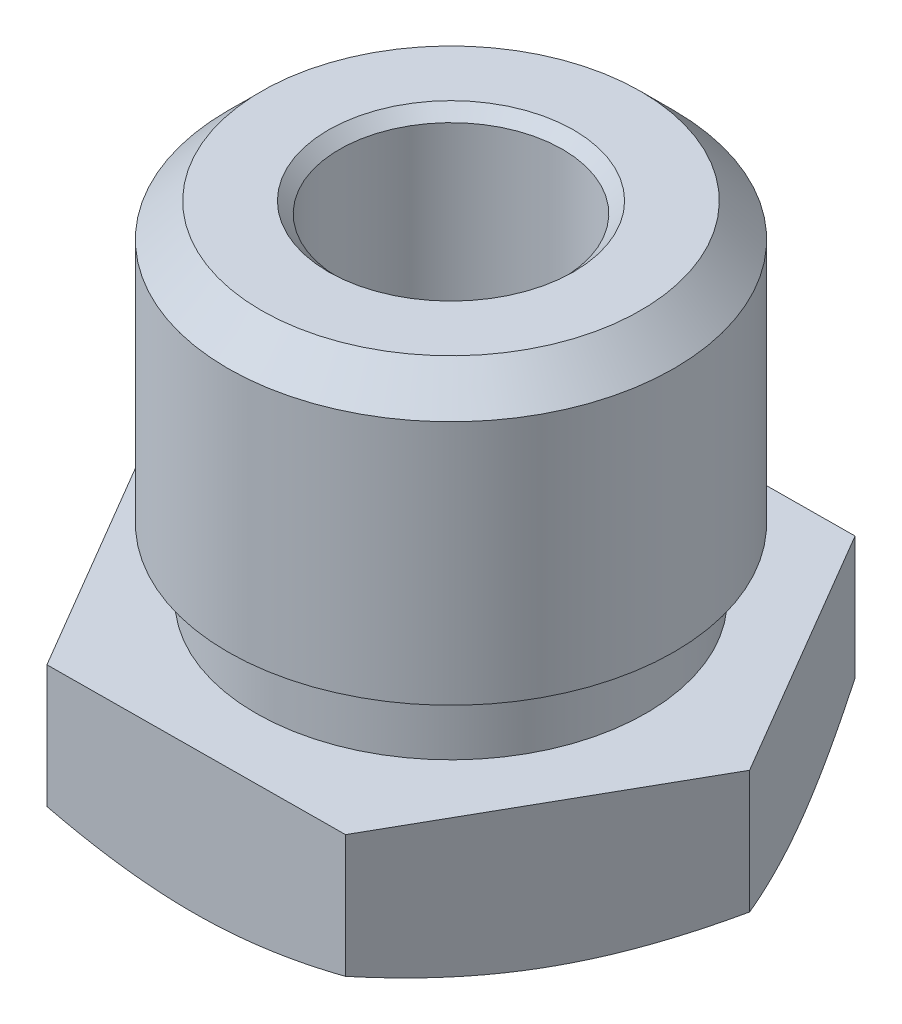
ISO-10303-21;
HEADER;
FILE_DESCRIPTION(('STEP AP214'),'2;1');
FILE_NAME('part.step','',(''),(''),'','','');
FILE_SCHEMA(('AUTOMOTIVE_DESIGN { 1 0 10303 214 1 1 1 1 }'));
ENDSEC;
DATA;
#1=APPLICATION_CONTEXT('core data for automotive mechanical design processes');
#2=APPLICATION_PROTOCOL_DEFINITION('international standard','automotive_design',2000,#1);
#3=PRODUCT_CONTEXT('',#1,'mechanical');
#4=PRODUCT('Part','Part','',(#3));
#5=PRODUCT_RELATED_PRODUCT_CATEGORY('part','',(#4));
#6=PRODUCT_DEFINITION_FORMATION('','',#4);
#7=PRODUCT_DEFINITION_CONTEXT('part definition',#1,'design');
#8=PRODUCT_DEFINITION('design','',#6,#7);
#9=PRODUCT_DEFINITION_SHAPE('','',#8);
#10=(LENGTH_UNIT() NAMED_UNIT(*) SI_UNIT(.MILLI.,.METRE.));
#11=(NAMED_UNIT(*) PLANE_ANGLE_UNIT() SI_UNIT($,.RADIAN.));
#12=(NAMED_UNIT(*) SI_UNIT($,.STERADIAN.) SOLID_ANGLE_UNIT());
#13=UNCERTAINTY_MEASURE_WITH_UNIT(LENGTH_MEASURE(1.E-05),#10,'distance_accuracy_value','');
#14=(GEOMETRIC_REPRESENTATION_CONTEXT(3) GLOBAL_UNCERTAINTY_ASSIGNED_CONTEXT((#13)) GLOBAL_UNIT_ASSIGNED_CONTEXT((#10,
#11,#12)) REPRESENTATION_CONTEXT('',''));
#15=CARTESIAN_POINT('',(0.,0.,0.));
#16=DIRECTION('',(0.,0.,1.));
#17=DIRECTION('',(1.,0.,0.));
#18=AXIS2_PLACEMENT_3D('',#15,#16,#17);
#19=CARTESIAN_POINT('',(13.2786844152626,6.5,-0.0993656540089263));
#20=DIRECTION('',(-0.862259714880802,0.,0.506466370150751));
#21=DIRECTION('',(0.506466370150751,0.,0.862259714880802));
#22=AXIS2_PLACEMENT_3D('',#19,#20,#21);
#23=PLANE('',#22);
#24=DIRECTION('',(0.,-1.,0.));
#25=VECTOR('',#24,1.);
#26=CARTESIAN_POINT('',(13.2786844152626,6.5,-0.0993656540089263));
#27=LINE('',#26,#25);
#28=CARTESIAN_POINT('',(13.2786844152626,6.5,-0.0993656540089263));
#29=VERTEX_POINT('',#28);
#30=CARTESIAN_POINT('',(13.2786844152626,0.999999999999913,-0.0993656540089263));
#31=VERTEX_POINT('',#30);
#32=EDGE_CURVE('E104',#29,#31,#27,.T.);
#33=ORIENTED_EDGE('',*,*,#32,.T.);
#34=CARTESIAN_POINT('',(13.278801889467,1.00005798792879,-0.0991656540089266));
#35=CARTESIAN_POINT('',(13.0892477828478,0.906495480012444,-0.421881789888406));
#36=CARTESIAN_POINT('',(12.8989551950581,0.818485549010916,-0.745855191010019));
#37=CARTESIAN_POINT('',(12.5168543572176,0.655424160118906,-1.39638241040671));
#38=CARTESIAN_POINT('',(12.3250453794867,0.580379375303605,-1.72293746755796));
#39=CARTESIAN_POINT('',(11.9397828409977,0.445101486414631,-2.37884748680155));
#40=CARTESIAN_POINT('',(11.7463272663629,0.384890468454874,-2.70820587752167));
#41=CARTESIAN_POINT('',(11.3582872115426,0.281279927851655,-3.36884462226612));
#42=CARTESIAN_POINT('',(11.1637029318079,0.237877507605416,-3.70012463502266));
#43=CARTESIAN_POINT('',(10.7781213489979,0.170174920080449,-4.35657782767609));
#44=CARTESIAN_POINT('',(10.5871427365605,0.145463994403388,-4.68171918673529));
#45=CARTESIAN_POINT('',(10.2047880025491,0.114463177060262,-5.33267866472373));
#46=CARTESIAN_POINT('',(10.0134118618347,0.108174193966666,-5.65849681623943));
#47=CARTESIAN_POINT('',(9.6309432470842,0.114261147632678,-6.30965017634794));
#48=CARTESIAN_POINT('',(9.43985068958976,0.126616979719078,-6.63498552702868));
#49=CARTESIAN_POINT('',(9.05821021566678,0.169480274015968,-7.28472897620153));
#50=CARTESIAN_POINT('',(8.86766225419606,0.199986188699251,-7.60913715137802));
#51=CARTESIAN_POINT('',(8.49944267573429,0.275586286577359,-8.23603150695678));
#52=CARTESIAN_POINT('',(8.32171553673145,0.319641320413002,-8.53861221366305));
#53=CARTESIAN_POINT('',(7.96725959631279,0.421466529051991,-9.14207395591501));
#54=CARTESIAN_POINT('',(7.7905309034253,0.479238166525155,-9.44295480669108));
#55=CARTESIAN_POINT('',(7.43626366329683,0.607771425592251,-10.0460952864308));
#56=CARTESIAN_POINT('',(7.25873805796857,0.67867070482349,-10.3483328817698));
#57=CARTESIAN_POINT('',(6.90498939101579,0.831480584190287,-10.950590489941));
#58=CARTESIAN_POINT('',(6.72876576088822,0.913386036987412,-11.2506114706506));
#59=CARTESIAN_POINT('',(6.55317155279144,1.00005798792881,-11.5495608594584));
#60=B_SPLINE_CURVE_WITH_KNOTS('',3,(#34,#35,#36,#37,#38,#39,#40,#41,#42,#43,#44,#45,#46,#47,#48,
#49,#50,#51,#52,#53,#54,#55,#56,#57,#58,#59),.UNSPECIFIED.,.F.,.F.,(4,2,2,2,2,2,2,2,2,2,2,2,4),
(0.,1.15741546007654,2.31542487092911,3.47514817024263,4.63467145793502,5.76790726441043,
6.901198961274,8.03326950451839,9.16524353806669,10.2259639835277,11.2867975897379,
12.3594596383154,13.4316217618208),.UNSPECIFIED.);
#61=CARTESIAN_POINT('',(6.55328902699588,0.999999999999936,-11.5493608594584));
#62=VERTEX_POINT('',#61);
#63=EDGE_CURVE('E53',#31,#62,#60,.T.);
#64=ORIENTED_EDGE('',*,*,#63,.T.);
#65=DIRECTION('',(0.,-1.,0.));
#66=VECTOR('',#65,1.);
#67=CARTESIAN_POINT('',(6.55328902699589,6.5,-11.5493608594584));
#68=LINE('',#67,#66);
#69=CARTESIAN_POINT('',(6.55328902699589,6.5,-11.5493608594584));
#70=VERTEX_POINT('',#69);
#71=EDGE_CURVE('E103',#70,#62,#68,.T.);
#72=ORIENTED_EDGE('',*,*,#71,.F.);
#73=DIRECTION('',(-0.506466370150751,0.,-0.862259714880802));
#74=VECTOR('',#73,1.);
#75=CARTESIAN_POINT('',(13.2786844152626,6.5,-0.0993656540089263));
#76=LINE('',#75,#74);
#77=EDGE_CURVE('E373',#29,#70,#76,.T.);
#78=ORIENTED_EDGE('',*,*,#77,.F.);
#79=EDGE_LOOP('',(#33,#64,#72,#78));
#80=FACE_BOUND('',#79,.T.);
#81=ADVANCED_FACE('F38',(#80),#23,.F.);
#82=CARTESIAN_POINT('',(6.55328902699589,6.5,-11.5493608594584));
#83=DIRECTION('',(0.00748288527264228,0.,0.999972002822077));
#84=DIRECTION('',(0.999972002822077,0.,-0.00748288527264229));
#85=AXIS2_PLACEMENT_3D('',#82,#83,#84);
#86=PLANE('',#85);
#87=ORIENTED_EDGE('',*,*,#71,.T.);
#88=CARTESIAN_POINT('',(6.55348902699589,1.00005000196466,-11.5493623560773));
#89=CARTESIAN_POINT('',(6.17923229772127,0.906488004955447,-11.5465617575008));
#90=CARTESIAN_POINT('',(5.80351750874437,0.818478587991021,-11.5437502481253));
#91=CARTESIAN_POINT('',(5.04909540759903,0.655418223151411,-11.5381048360397));
#92=CARTESIAN_POINT('',(4.67038665870723,0.580373948311718,-11.5352709225784));
#93=CARTESIAN_POINT('',(3.90972211150778,0.445097066884958,-11.5295787976773));
#94=CARTESIAN_POINT('',(3.52776233709572,0.384886545907937,-11.5267205564839));
#95=CARTESIAN_POINT('',(2.76161388734343,0.281276966483241,-11.5209873950203));
#96=CARTESIAN_POINT('',(2.37742560777006,0.237875010449097,-11.5181124777116));
#97=CARTESIAN_POINT('',(1.61613116407676,0.170173285486741,-11.5124156392353));
#98=CARTESIAN_POINT('',(1.23906190221761,0.145462761642441,-11.5095939942109));
#99=CARTESIAN_POINT('',(0.484138552019265,0.114462686189678,-11.5039448312311));
#100=CARTESIAN_POINT('',(0.106284425889888,0.108174043157357,-11.5011173129929));
#101=CARTESIAN_POINT('',(-0.648863742889136,0.114261600739779,-11.4954664676744));
#102=CARTESIAN_POINT('',(-1.02615795033378,0.126617696996423,-11.4926431393608));
#103=CARTESIAN_POINT('',(-1.77967101273376,0.16948143639026,-11.4870045296983));
#104=CARTESIAN_POINT('',(-2.15588995662197,0.199987531999137,-11.4841892476838));
#105=CARTESIAN_POINT('',(-2.88290153838933,0.275587568352364,-11.4787489511126));
#106=CARTESIAN_POINT('',(-3.23380381381667,0.319642229755087,-11.4761231161277));
#107=CARTESIAN_POINT('',(-3.93363727744409,0.421466387743175,-11.4708861959905));
#108=CARTESIAN_POINT('',(-4.28256825138991,0.47923734682663,-11.4682751124414));
#109=CARTESIAN_POINT('',(-4.98202913527991,0.607768971979282,-11.4630409803536));
#110=CARTESIAN_POINT('',(-5.33253349355472,0.678667290738526,-11.4604181230205));
#111=CARTESIAN_POINT('',(-6.03097051886239,0.831475033525346,-11.4551916525635));
#112=CARTESIAN_POINT('',(-6.37890430827846,0.913379310541671,-11.4525880310408));
#113=CARTESIAN_POINT('',(-6.72559538826666,1.00005000196464,-11.4499937088305));
#114=B_SPLINE_CURVE_WITH_KNOTS('',3,(#88,#89,#90,#91,#92,#93,#94,#95,#96,#97,#98,#99,#100,#101,
#102,#103,#104,#105,#106,#107,#108,#109,#110,#111,#112,#113),.UNSPECIFIED.,.F.,.F.,(4,2,2,2,2,2,
2,2,2,2,2,2,4),(0.,1.15741306233225,2.31542007088461,3.47514092704066,4.63466177273383,
5.76789534332623,6.90118480460978,8.03325312886427,9.16522494310022,10.225933731874,
11.2867556693873,12.3594057431476,13.4315559193472),.UNSPECIFIED.);
#115=CARTESIAN_POINT('',(-6.72539538826666,0.999999999999913,-11.4499952054494));
#116=VERTEX_POINT('',#115);
#117=EDGE_CURVE('E90',#62,#116,#114,.T.);
#118=ORIENTED_EDGE('',*,*,#117,.T.);
#119=DIRECTION('',(0.,-1.,0.));
#120=VECTOR('',#119,1.);
#121=CARTESIAN_POINT('',(-6.72539538826666,6.5,-11.4499952054494));
#122=LINE('',#121,#120);
#123=CARTESIAN_POINT('',(-6.72539538826666,6.5,-11.4499952054494));
#124=VERTEX_POINT('',#123);
#125=EDGE_CURVE('E110',#124,#116,#122,.T.);
#126=ORIENTED_EDGE('',*,*,#125,.F.);
#127=DIRECTION('',(-0.999972002822077,0.,0.00748288527264229));
#128=VECTOR('',#127,1.);
#129=CARTESIAN_POINT('',(6.55328902699589,6.5,-11.5493608594584));
#130=LINE('',#129,#128);
#131=EDGE_CURVE('E108',#70,#124,#130,.T.);
#132=ORIENTED_EDGE('',*,*,#131,.F.);
#133=EDGE_LOOP('',(#87,#118,#126,#132));
#134=FACE_BOUND('',#133,.T.);
#135=ADVANCED_FACE('F107',(#134),#86,.F.);
#136=CARTESIAN_POINT('',(-6.72539538826666,6.5,-11.4499952054494));
#137=DIRECTION('',(0.869742600153444,0.,0.493505632671326));
#138=DIRECTION('',(0.493505632671326,0.,-0.869742600153445));
#139=AXIS2_PLACEMENT_3D('',#136,#137,#138);
#140=PLANE('',#139);
#141=ORIENTED_EDGE('',*,*,#125,.T.);
#142=CARTESIAN_POINT('',(-6.72528190512059,1.00005748901951,-11.4501952054494));
#143=CARTESIAN_POINT('',(-6.90998520223733,0.906495013021198,-11.1246785036001));
#144=CARTESIAN_POINT('',(-7.0954080822684,0.818485114133238,-10.7978936259216));
#145=CARTESIAN_POINT('',(-7.46773071755255,0.655423789217099,-10.1417210607673));
#146=CARTESIAN_POINT('',(-7.65463118186342,0.580379036261622,-9.81233212366499));
#147=CARTESIAN_POINT('',(-8.0300346068258,0.445101210312064,-9.15073004798871));
#148=CARTESIAN_POINT('',(-8.21853952981428,0.384890223400421,-8.81851345103871));
#149=CARTESIAN_POINT('',(-8.59664939141831,0.281279742845111,-8.15214161573655));
#150=CARTESIAN_POINT('',(-8.78625413471284,0.237877351599687,-7.81798672161351));
#151=CARTESIAN_POINT('',(-9.16196843863417,0.170174817961751,-7.15583676024718));
#152=CARTESIAN_POINT('',(-9.34805978694809,0.145463917388455,-6.82787378995135));
#153=CARTESIAN_POINT('',(-9.72062981965142,0.11446314639355,-6.17126521746428));
#154=CARTESIAN_POINT('',(-9.90710852269132,0.108174184544641,-5.84261958240385));
#155=CARTESIAN_POINT('',(-10.2797895209837,0.114261175939173,-5.18581544679942));
#156=CARTESIAN_POINT('',(-10.4659918975592,0.12661702452909,-4.85765680293364));
#157=CARTESIAN_POINT('',(-10.8378659470453,0.169480346632508,-4.20227481473041));
#158=CARTESIAN_POINT('',(-11.0235376638455,0.199986272618733,-3.87505139304302));
#159=CARTESIAN_POINT('',(-11.3823341688252,0.275586366653234,-3.24271695852426));
#160=CARTESIAN_POINT('',(-11.5555130586223,0.319641377221881,-2.93751059828783));
#161=CARTESIAN_POINT('',(-11.9008980498391,0.421466520223448,-2.32881229693535));
#162=CARTESIAN_POINT('',(-12.0731040455087,0.479238115315458,-2.02532054219103));
#163=CARTESIAN_POINT('',(-12.4183051651242,0.607771272306696,-1.41694629177955));
#164=CARTESIAN_POINT('',(-12.5912876783775,0.678670491534158,-1.11208602089748));
#165=CARTESIAN_POINT('',(-12.9359834959049,0.831480237421918,-0.504602302878869));
#166=CARTESIAN_POINT('',(-13.1076973541314,0.913385616764226,-0.201977879469661));
#167=CARTESIAN_POINT('',(-13.2787978984086,1.00005748901945,0.0995656540089277));
#168=B_SPLINE_CURVE_WITH_KNOTS('',3,(#142,#143,#144,#145,#146,#147,#148,#149,#150,#151,#152,
#153,#154,#155,#156,#157,#158,#159,#160,#161,#162,#163,#164,#165,#166,#167),.UNSPECIFIED.,.F.,
.F.,(4,2,2,2,2,2,2,2,2,2,2,2,4),(0.,1.15741531028125,2.31542457105391,3.47514771773503,
4.63467085286736,5.76790651965949,6.90119807685872,8.03326848147521,9.16524237637546,
10.2259620936075,11.2867949708385,12.3594562713123,13.4316176484328),.UNSPECIFIED.);
#169=CARTESIAN_POINT('',(-13.2786844152626,0.999999999999867,0.0993656540089118));
#170=VERTEX_POINT('',#169);
#171=EDGE_CURVE('E93',#116,#170,#168,.T.);
#172=ORIENTED_EDGE('',*,*,#171,.T.);
#173=DIRECTION('',(0.,-1.,0.));
#174=VECTOR('',#173,1.);
#175=CARTESIAN_POINT('',(-13.2786844152625,6.5,0.0993656540089282));
#176=LINE('',#175,#174);
#177=CARTESIAN_POINT('',(-13.2786844152625,6.5,0.0993656540089282));
#178=VERTEX_POINT('',#177);
#179=EDGE_CURVE('E115',#178,#170,#176,.T.);
#180=ORIENTED_EDGE('',*,*,#179,.F.);
#181=DIRECTION('',(-0.493505632671326,0.,0.869742600153444));
#182=VECTOR('',#181,1.);
#183=CARTESIAN_POINT('',(-6.72539538826666,6.5,-11.4499952054494));
#184=LINE('',#183,#182);
#185=EDGE_CURVE('E370',#124,#178,#184,.T.);
#186=ORIENTED_EDGE('',*,*,#185,.F.);
#187=EDGE_LOOP('',(#141,#172,#180,#186));
#188=FACE_BOUND('',#187,.T.);
#189=ADVANCED_FACE('F195',(#188),#140,.F.);
#190=CARTESIAN_POINT('',(-13.2786844152625,6.5,0.0993656540089282));
#191=DIRECTION('',(0.862259714880802,0.,-0.506466370150751));
#192=DIRECTION('',(-0.506466370150751,0.,-0.862259714880802));
#193=AXIS2_PLACEMENT_3D('',#190,#191,#192);
#194=PLANE('',#193);
#195=ORIENTED_EDGE('',*,*,#179,.T.);
#196=CARTESIAN_POINT('',(-13.278801889467,1.00005798792873,0.0991656540089284));
#197=CARTESIAN_POINT('',(-13.0892477828478,0.906495480012392,0.421881789888409));
#198=CARTESIAN_POINT('',(-12.8989551950581,0.818485549010863,0.745855191010022));
#199=CARTESIAN_POINT('',(-12.5168543572176,0.655424160118849,1.39638241040671));
#200=CARTESIAN_POINT('',(-12.3250453794867,0.580379375303546,1.72293746755796));
#201=CARTESIAN_POINT('',(-11.9397828409977,0.44510148641457,2.37884748680155));
#202=CARTESIAN_POINT('',(-11.7463272663629,0.384890468454813,2.70820587752167));
#203=CARTESIAN_POINT('',(-11.3582872115426,0.281279927851592,3.36884462226613));
#204=CARTESIAN_POINT('',(-11.1637029318079,0.237877507605351,3.70012463502267));
#205=CARTESIAN_POINT('',(-10.7781213489979,0.170174920080382,4.3565778276761));
#206=CARTESIAN_POINT('',(-10.5871427365605,0.14546399440332,4.6817191867353));
#207=CARTESIAN_POINT('',(-10.2047880025491,0.114463177060191,5.33267866472375));
#208=CARTESIAN_POINT('',(-10.0134118618347,0.108174193966594,5.65849681623944));
#209=CARTESIAN_POINT('',(-9.63094324708419,0.114261147632604,6.30965017634795));
#210=CARTESIAN_POINT('',(-9.43985068958975,0.126616979719004,6.6349855270287));
#211=CARTESIAN_POINT('',(-9.05821021566677,0.169480274015891,7.28472897620155));
#212=CARTESIAN_POINT('',(-8.86766225419604,0.199986188699173,7.60913715137804));
#213=CARTESIAN_POINT('',(-8.49944267573428,0.275586286577279,8.2360315069568));
#214=CARTESIAN_POINT('',(-8.32171553673143,0.319641320412921,8.53861221366307));
#215=CARTESIAN_POINT('',(-7.96725959631278,0.421466529051907,9.14207395591502));
#216=CARTESIAN_POINT('',(-7.79053090342528,0.47923816652507,9.44295480669109));
#217=CARTESIAN_POINT('',(-7.43626366329682,0.607771425592162,10.0460952864309));
#218=CARTESIAN_POINT('',(-7.25873805796856,0.678670704823399,10.3483328817698));
#219=CARTESIAN_POINT('',(-6.90498939101578,0.831480584190192,10.950590489941));
#220=CARTESIAN_POINT('',(-6.72876576088821,0.913386036987316,11.2506114706506));
#221=CARTESIAN_POINT('',(-6.55317155279144,1.00005798792871,11.5495608594584));
#222=B_SPLINE_CURVE_WITH_KNOTS('',3,(#196,#197,#198,#199,#200,#201,#202,#203,#204,#205,#206,
#207,#208,#209,#210,#211,#212,#213,#214,#215,#216,#217,#218,#219,#220,#221),.UNSPECIFIED.,.F.,
.F.,(4,2,2,2,2,2,2,2,2,2,2,2,4),(0.,1.15741546007654,2.31542487092912,3.47514817024264,
4.63467145793503,5.76790726441044,6.90119896127402,8.03326950451842,9.16524353806671,
10.2259639835277,11.2867975897379,12.3594596383154,13.4316217618208),.UNSPECIFIED.);
#223=CARTESIAN_POINT('',(-6.5532890269959,0.999999999999844,11.5493608594584));
#224=VERTEX_POINT('',#223);
#225=EDGE_CURVE('E174',#170,#224,#222,.T.);
#226=ORIENTED_EDGE('',*,*,#225,.T.);
#227=DIRECTION('',(0.,-1.,0.));
#228=VECTOR('',#227,1.);
#229=CARTESIAN_POINT('',(-6.55328902699588,6.5,11.5493608594584));
#230=LINE('',#229,#228);
#231=CARTESIAN_POINT('',(-6.55328902699588,6.5,11.5493608594584));
#232=VERTEX_POINT('',#231);
#233=EDGE_CURVE('E352',#232,#224,#230,.T.);
#234=ORIENTED_EDGE('',*,*,#233,.F.);
#235=DIRECTION('',(0.506466370150751,0.,0.862259714880802));
#236=VECTOR('',#235,1.);
#237=CARTESIAN_POINT('',(-13.2786844152625,6.5,0.0993656540089282));
#238=LINE('',#237,#236);
#239=EDGE_CURVE('E368',#178,#232,#238,.T.);
#240=ORIENTED_EDGE('',*,*,#239,.F.);
#241=EDGE_LOOP('',(#195,#226,#234,#240));
#242=FACE_BOUND('',#241,.T.);
#243=ADVANCED_FACE('F311',(#242),#194,.F.);
#244=CARTESIAN_POINT('',(-6.55328902699588,6.5,11.5493608594584));
#245=DIRECTION('',(-0.00748288527264255,0.,-0.999972002822077));
#246=DIRECTION('',(-0.999972002822077,0.,0.00748288527264255));
#247=AXIS2_PLACEMENT_3D('',#244,#245,#246);
#248=PLANE('',#247);
#249=ORIENTED_EDGE('',*,*,#233,.T.);
#250=CARTESIAN_POINT('',(-6.55348902699588,1.00005000196456,11.5493623560773));
#251=CARTESIAN_POINT('',(-6.17923229772126,0.906488004955348,11.5465617575008));
#252=CARTESIAN_POINT('',(-5.80351750874437,0.818478587990924,11.5437502481253));
#253=CARTESIAN_POINT('',(-5.04909540759902,0.655418223151318,11.5381048360397));
#254=CARTESIAN_POINT('',(-4.67038665870722,0.580373948311626,11.5352709225784));
#255=CARTESIAN_POINT('',(-3.90972211150776,0.44509706688487,11.5295787976773));
#256=CARTESIAN_POINT('',(-3.5277623370957,0.384886545907851,11.5267205564839));
#257=CARTESIAN_POINT('',(-2.76161388734341,0.281276966483157,11.5209873950203));
#258=CARTESIAN_POINT('',(-2.37742560777005,0.237875010449014,11.5181124777116));
#259=CARTESIAN_POINT('',(-1.61613116407674,0.170173285486662,11.5124156392353));
#260=CARTESIAN_POINT('',(-1.23906190221759,0.145462761642364,11.5095939942109));
#261=CARTESIAN_POINT('',(-0.484138552019243,0.114462686189606,11.5039448312311));
#262=CARTESIAN_POINT('',(-0.106284425889866,0.108174043157287,11.5011173129929));
#263=CARTESIAN_POINT('',(0.64886374288916,0.114261600739711,11.4954664676744));
#264=CARTESIAN_POINT('',(1.0261579503338,0.126617696996355,11.4926431393608));
#265=CARTESIAN_POINT('',(1.77967101273379,0.169481436390195,11.4870045296983));
#266=CARTESIAN_POINT('',(2.155889956622,0.199987531999075,11.4841892476838));
#267=CARTESIAN_POINT('',(2.88290153838935,0.275587568352305,11.4787489511126));
#268=CARTESIAN_POINT('',(3.23380381381669,0.319642229755029,11.4761231161277));
#269=CARTESIAN_POINT('',(3.93363727744411,0.421466387743119,11.4708861959905));
#270=CARTESIAN_POINT('',(4.28256825138993,0.479237346826575,11.4682751124414));
#271=CARTESIAN_POINT('',(4.98202913527992,0.607768971979228,11.4630409803536));
#272=CARTESIAN_POINT('',(5.33253349355473,0.678667290738473,11.4604181230205));
#273=CARTESIAN_POINT('',(6.0309705188624,0.831475033525294,11.4551916525635));
#274=CARTESIAN_POINT('',(6.37890430827846,0.91337931054162,11.4525880310408));
#275=CARTESIAN_POINT('',(6.72559538826665,1.00005000196459,11.4499937088305));
#276=B_SPLINE_CURVE_WITH_KNOTS('',3,(#250,#251,#252,#253,#254,#255,#256,#257,#258,#259,#260,
#261,#262,#263,#264,#265,#266,#267,#268,#269,#270,#271,#272,#273,#274,#275),.UNSPECIFIED.,.F.,
.F.,(4,2,2,2,2,2,2,2,2,2,2,2,4),(0.,1.15741306233225,2.31542007088462,3.47514092704067,
4.63466177273384,5.76789534332625,6.90118480460979,8.03325312886429,9.16522494310024,
10.2259337318741,11.2867556693873,12.3594057431476,13.4315559193472),.UNSPECIFIED.);
#277=CARTESIAN_POINT('',(6.72539538826665,0.999999999999867,11.4499952054494));
#278=VERTEX_POINT('',#277);
#279=EDGE_CURVE('E147',#224,#278,#276,.T.);
#280=ORIENTED_EDGE('',*,*,#279,.T.);
#281=DIRECTION('',(0.,-1.,0.));
#282=VECTOR('',#281,1.);
#283=CARTESIAN_POINT('',(6.72539538826666,6.5,11.4499952054494));
#284=LINE('',#283,#282);
#285=CARTESIAN_POINT('',(6.72539538826666,6.5,11.4499952054494));
#286=VERTEX_POINT('',#285);
#287=EDGE_CURVE('E355',#286,#278,#284,.T.);
#288=ORIENTED_EDGE('',*,*,#287,.F.);
#289=DIRECTION('',(0.999972002822077,0.,-0.00748288527264255));
#290=VECTOR('',#289,1.);
#291=CARTESIAN_POINT('',(-6.55328902699588,6.5,11.5493608594584));
#292=LINE('',#291,#290);
#293=EDGE_CURVE('E366',#232,#286,#292,.T.);
#294=ORIENTED_EDGE('',*,*,#293,.F.);
#295=EDGE_LOOP('',(#249,#280,#288,#294));
#296=FACE_BOUND('',#295,.T.);
#297=ADVANCED_FACE('F303',(#296),#248,.F.);
#298=CARTESIAN_POINT('',(6.72539538826666,6.5,11.4499952054494));
#299=DIRECTION('',(-0.869742600153444,0.,-0.493505632671326));
#300=DIRECTION('',(-0.493505632671326,0.,0.869742600153444));
#301=AXIS2_PLACEMENT_3D('',#298,#299,#300);
#302=PLANE('',#301);
#303=ORIENTED_EDGE('',*,*,#287,.T.);
#304=CARTESIAN_POINT('',(6.72528190512059,1.00005748901945,11.4501952054494));
#305=CARTESIAN_POINT('',(6.90998520223733,0.906495013021148,11.1246785036001));
#306=CARTESIAN_POINT('',(7.0954080822684,0.818485114133191,10.7978936259216));
#307=CARTESIAN_POINT('',(7.46773071755254,0.655423789217059,10.1417210607673));
#308=CARTESIAN_POINT('',(7.65463118186342,0.580379036261586,9.81233212366499));
#309=CARTESIAN_POINT('',(8.03003460682579,0.445101210312034,9.15073004798871));
#310=CARTESIAN_POINT('',(8.21853952981428,0.384890223400393,8.81851345103871));
#311=CARTESIAN_POINT('',(8.5966493914183,0.281279742845089,8.15214161573655));
#312=CARTESIAN_POINT('',(8.78625413471283,0.237877351599668,7.8179867216135));
#313=CARTESIAN_POINT('',(9.16196843863417,0.170174817961738,7.15583676024718));
#314=CARTESIAN_POINT('',(9.3480597869481,0.145463917388445,6.82787378995134));
#315=CARTESIAN_POINT('',(9.72062981965142,0.114463146393546,6.17126521746428));
#316=CARTESIAN_POINT('',(9.90710852269132,0.108174184544639,5.84261958240385));
#317=CARTESIAN_POINT('',(10.2797895209837,0.114261175939176,5.18581544679942));
#318=CARTESIAN_POINT('',(10.4659918975592,0.126617024529097,4.85765680293364));
#319=CARTESIAN_POINT('',(10.8378659470453,0.169480346632521,4.20227481473041));
#320=CARTESIAN_POINT('',(11.0235376638455,0.199986272618748,3.87505139304302));
#321=CARTESIAN_POINT('',(11.3823341688252,0.275586366653254,3.24271695852426));
#322=CARTESIAN_POINT('',(11.5555130586223,0.319641377221903,2.93751059828783));
#323=CARTESIAN_POINT('',(11.9008980498391,0.421466520223476,2.32881229693535));
#324=CARTESIAN_POINT('',(12.0731040455087,0.47923811531549,2.02532054219103));
#325=CARTESIAN_POINT('',(12.4183051651242,0.607771272306734,1.41694629177955));
#326=CARTESIAN_POINT('',(12.5912876783775,0.678670491534198,1.11208602089748));
#327=CARTESIAN_POINT('',(12.9359834959049,0.831480237421963,0.504602302878869));
#328=CARTESIAN_POINT('',(13.1076973541314,0.913385616764273,0.201977879469661));
#329=CARTESIAN_POINT('',(13.2787978984086,1.0000574890195,-0.0995656540089264));
#330=B_SPLINE_CURVE_WITH_KNOTS('',3,(#304,#305,#306,#307,#308,#309,#310,#311,#312,#313,#314,
#315,#316,#317,#318,#319,#320,#321,#322,#323,#324,#325,#326,#327,#328,#329),.UNSPECIFIED.,.F.,
.F.,(4,2,2,2,2,2,2,2,2,2,2,2,4),(0.,1.15741531028125,2.3154245710539,3.47514771773502,
4.63467085286735,5.76790651965948,6.90119807685872,8.03326848147521,9.16524237637545,
10.2259620936075,11.2867949708385,12.3594562713123,13.4316176484328),.UNSPECIFIED.);
#331=EDGE_CURVE('E145',#278,#31,#330,.T.);
#332=ORIENTED_EDGE('',*,*,#331,.T.);
#333=ORIENTED_EDGE('',*,*,#32,.F.);
#334=DIRECTION('',(0.493505632671326,0.,-0.869742600153444));
#335=VECTOR('',#334,1.);
#336=CARTESIAN_POINT('',(6.72539538826666,6.5,11.4499952054494));
#337=LINE('',#336,#335);
#338=EDGE_CURVE('E61',#286,#29,#337,.T.);
#339=ORIENTED_EDGE('',*,*,#338,.F.);
#340=EDGE_LOOP('',(#303,#332,#333,#339));
#341=FACE_BOUND('',#340,.T.);
#342=ADVANCED_FACE('F160',(#341),#302,.F.);
#343=CARTESIAN_POINT('',(0.,6.5,0.));
#344=DIRECTION('',(0.,1.,0.));
#345=DIRECTION('',(0.,0.,1.));
#346=AXIS2_PLACEMENT_3D('',#343,#344,#345);
#347=PLANE('',#346);
#348=CARTESIAN_POINT('',(0.,6.5,0.));
#349=DIRECTION('',(0.,1.,0.));
#350=DIRECTION('',(0.,0.,1.));
#351=AXIS2_PLACEMENT_3D('',#348,#349,#350);
#352=CIRCLE('',#351,8.75);
#353=CARTESIAN_POINT('',(0.,6.5,8.75));
#354=VERTEX_POINT('',#353);
#355=EDGE_CURVE('E376',#354,#354,#352,.T.);
#356=ORIENTED_EDGE('',*,*,#355,.F.);
#357=EDGE_LOOP('',(#356));
#358=FACE_BOUND('',#357,.T.);
#359=ORIENTED_EDGE('',*,*,#77,.T.);
#360=ORIENTED_EDGE('',*,*,#131,.T.);
#361=ORIENTED_EDGE('',*,*,#185,.T.);
#362=ORIENTED_EDGE('',*,*,#239,.T.);
#363=ORIENTED_EDGE('',*,*,#293,.T.);
#364=ORIENTED_EDGE('',*,*,#338,.T.);
#365=EDGE_LOOP('',(#359,#360,#361,#362,#363,#364));
#366=FACE_BOUND('',#365,.T.);
#367=ADVANCED_FACE('F286',(#358,#366),#347,.T.);
#368=CARTESIAN_POINT('',(0.,9.5,0.));
#369=DIRECTION('',(0.,-1.,0.));
#370=DIRECTION('',(0.,0.,-1.));
#371=AXIS2_PLACEMENT_3D('',#368,#369,#370);
#372=CYLINDRICAL_SURFACE('',#371,8.75);
#373=CARTESIAN_POINT('',(0.,9.5,0.));
#374=DIRECTION('',(0.,1.,0.));
#375=DIRECTION('',(0.,0.,1.));
#376=AXIS2_PLACEMENT_3D('',#373,#374,#375);
#377=CIRCLE('',#376,8.75);
#378=CARTESIAN_POINT('',(0.,9.5,8.75));
#379=VERTEX_POINT('',#378);
#380=EDGE_CURVE('E375',#379,#379,#377,.T.);
#381=ORIENTED_EDGE('',*,*,#380,.F.);
#382=EDGE_LOOP('',(#381));
#383=FACE_BOUND('',#382,.T.);
#384=ORIENTED_EDGE('',*,*,#355,.T.);
#385=EDGE_LOOP('',(#384));
#386=FACE_BOUND('',#385,.T.);
#387=ADVANCED_FACE('F217',(#383,#386),#372,.T.);
#388=CARTESIAN_POINT('',(0.,22.,0.));
#389=DIRECTION('',(0.,-1.,0.));
#390=DIRECTION('',(0.,0.,-1.));
#391=AXIS2_PLACEMENT_3D('',#388,#389,#390);
#392=CYLINDRICAL_SURFACE('',#391,10.);
#393=CARTESIAN_POINT('',(0.,20.5,0.));
#394=DIRECTION('',(0.,1.,0.));
#395=DIRECTION('',(0.,0.,1.));
#396=AXIS2_PLACEMENT_3D('',#393,#394,#395);
#397=CIRCLE('',#396,10.);
#398=CARTESIAN_POINT('',(0.,20.5,10.));
#399=VERTEX_POINT('',#398);
#400=EDGE_CURVE('E113',#399,#399,#397,.F.);
#401=ORIENTED_EDGE('',*,*,#400,.T.);
#402=EDGE_LOOP('',(#401));
#403=FACE_BOUND('',#402,.T.);
#404=CARTESIAN_POINT('',(0.,9.5,0.));
#405=DIRECTION('',(0.,1.,0.));
#406=DIRECTION('',(0.,0.,1.));
#407=AXIS2_PLACEMENT_3D('',#404,#405,#406);
#408=CIRCLE('',#407,10.);
#409=CARTESIAN_POINT('',(0.,9.5,10.));
#410=VERTEX_POINT('',#409);
#411=EDGE_CURVE('E105',#410,#410,#408,.T.);
#412=ORIENTED_EDGE('',*,*,#411,.T.);
#413=EDGE_LOOP('',(#412));
#414=FACE_BOUND('',#413,.T.);
#415=ADVANCED_FACE('F212',(#403,#414),#392,.T.);
#416=CARTESIAN_POINT('',(0.,22.,0.));
#417=DIRECTION('',(0.,1.,0.));
#418=DIRECTION('',(0.,0.,1.));
#419=AXIS2_PLACEMENT_3D('',#416,#417,#418);
#420=PLANE('',#419);
#421=CARTESIAN_POINT('',(0.,22.,0.));
#422=DIRECTION('',(0.,1.,0.));
#423=DIRECTION('',(0.,0.,1.));
#424=AXIS2_PLACEMENT_3D('',#421,#422,#423);
#425=CIRCLE('',#424,5.5);
#426=CARTESIAN_POINT('',(0.,22.,5.5));
#427=VERTEX_POINT('',#426);
#428=EDGE_CURVE('E11',#427,#427,#425,.F.);
#429=ORIENTED_EDGE('',*,*,#428,.T.);
#430=EDGE_LOOP('',(#429));
#431=FACE_BOUND('',#430,.T.);
#432=CARTESIAN_POINT('',(0.,22.,0.));
#433=DIRECTION('',(0.,1.,0.));
#434=DIRECTION('',(0.,0.,1.));
#435=AXIS2_PLACEMENT_3D('',#432,#433,#434);
#436=CIRCLE('',#435,8.5);
#437=CARTESIAN_POINT('',(0.,22.,8.5));
#438=VERTEX_POINT('',#437);
#439=EDGE_CURVE('E109',#438,#438,#436,.T.);
#440=ORIENTED_EDGE('',*,*,#439,.T.);
#441=EDGE_LOOP('',(#440));
#442=FACE_BOUND('',#441,.T.);
#443=ADVANCED_FACE('F167',(#431,#442),#420,.T.);
#444=CARTESIAN_POINT('',(0.,9.5,0.));
#445=DIRECTION('',(0.,1.,0.));
#446=DIRECTION('',(0.,0.,1.));
#447=AXIS2_PLACEMENT_3D('',#444,#445,#446);
#448=PLANE('',#447);
#449=ORIENTED_EDGE('',*,*,#380,.T.);
#450=EDGE_LOOP('',(#449));
#451=FACE_BOUND('',#450,.T.);
#452=ORIENTED_EDGE('',*,*,#411,.F.);
#453=EDGE_LOOP('',(#452));
#454=FACE_BOUND('',#453,.T.);
#455=ADVANCED_FACE('F201',(#451,#454),#448,.F.);
#456=CARTESIAN_POINT('',(0.,22.,0.));
#457=DIRECTION('',(0.,-1.,0.));
#458=DIRECTION('',(0.,0.,-1.));
#459=AXIS2_PLACEMENT_3D('',#456,#457,#458);
#460=CONICAL_SURFACE('',#459,8.5,0.785398163397445);
#461=ORIENTED_EDGE('',*,*,#400,.F.);
#462=EDGE_LOOP('',(#461));
#463=FACE_BOUND('',#462,.T.);
#464=ORIENTED_EDGE('',*,*,#439,.F.);
#465=EDGE_LOOP('',(#464));
#466=FACE_BOUND('',#465,.T.);
#467=ADVANCED_FACE('F166',(#463,#466),#460,.T.);
#468=CARTESIAN_POINT('',(0.,0.99999999999989,0.));
#469=DIRECTION('',(0.,1.,0.));
#470=DIRECTION('',(0.,0.,1.));
#471=AXIS2_PLACEMENT_3D('',#468,#469,#470);
#472=CONICAL_SURFACE('',#471,13.2790561913614,1.10714871779413);
#473=CARTESIAN_POINT('',(0.,0.,0.));
#474=DIRECTION('',(0.,-1.,0.));
#475=DIRECTION('',(0.,0.,-1.));
#476=AXIS2_PLACEMENT_3D('',#473,#474,#475);
#477=CIRCLE('',#476,11.2790561913614);
#478=CARTESIAN_POINT('',(0.,0.,-11.2790561913614));
#479=VERTEX_POINT('',#478);
#480=EDGE_CURVE('E143',#479,#479,#477,.T.);
#481=ORIENTED_EDGE('',*,*,#480,.F.);
#482=EDGE_LOOP('',(#481));
#483=FACE_BOUND('',#482,.T.);
#484=ORIENTED_EDGE('',*,*,#331,.F.);
#485=ORIENTED_EDGE('',*,*,#279,.F.);
#486=ORIENTED_EDGE('',*,*,#225,.F.);
#487=ORIENTED_EDGE('',*,*,#171,.F.);
#488=ORIENTED_EDGE('',*,*,#117,.F.);
#489=ORIENTED_EDGE('',*,*,#63,.F.);
#490=EDGE_LOOP('',(#484,#485,#486,#487,#488,#489));
#491=FACE_BOUND('',#490,.T.);
#492=ADVANCED_FACE('F91',(#483,#491),#472,.T.);
#493=CARTESIAN_POINT('',(0.,0.,0.));
#494=DIRECTION('',(0.,1.,0.));
#495=DIRECTION('',(0.,0.,1.));
#496=AXIS2_PLACEMENT_3D('',#493,#494,#495);
#497=PLANE('',#496);
#498=CARTESIAN_POINT('',(0.,0.,0.));
#499=DIRECTION('',(0.,1.,0.));
#500=DIRECTION('',(0.,0.,1.));
#501=AXIS2_PLACEMENT_3D('',#498,#499,#500);
#502=CIRCLE('',#501,5.50000000000004);
#503=CARTESIAN_POINT('',(0.,0.,5.50000000000004));
#504=VERTEX_POINT('',#503);
#505=EDGE_CURVE('E121',#504,#504,#502,.T.);
#506=ORIENTED_EDGE('',*,*,#505,.T.);
#507=EDGE_LOOP('',(#506));
#508=FACE_BOUND('',#507,.T.);
#509=ORIENTED_EDGE('',*,*,#480,.T.);
#510=EDGE_LOOP('',(#509));
#511=FACE_BOUND('',#510,.T.);
#512=ADVANCED_FACE('F137',(#508,#511),#497,.F.);
#513=CARTESIAN_POINT('',(0.,0.,0.));
#514=DIRECTION('',(0.,1.,0.));
#515=DIRECTION('',(0.,0.,1.));
#516=AXIS2_PLACEMENT_3D('',#513,#514,#515);
#517=CYLINDRICAL_SURFACE('',#516,5.);
#518=CARTESIAN_POINT('',(0.,0.500000000000036,0.));
#519=DIRECTION('',(0.,1.,0.));
#520=DIRECTION('',(0.,0.,1.));
#521=AXIS2_PLACEMENT_3D('',#518,#519,#520);
#522=CIRCLE('',#521,5.);
#523=CARTESIAN_POINT('',(0.,0.500000000000036,5.));
#524=VERTEX_POINT('',#523);
#525=EDGE_CURVE('E46',#524,#524,#522,.F.);
#526=ORIENTED_EDGE('',*,*,#525,.T.);
#527=EDGE_LOOP('',(#526));
#528=FACE_BOUND('',#527,.T.);
#529=CARTESIAN_POINT('',(0.,21.5,0.));
#530=DIRECTION('',(0.,1.,0.));
#531=DIRECTION('',(0.,0.,1.));
#532=AXIS2_PLACEMENT_3D('',#529,#530,#531);
#533=CIRCLE('',#532,5.);
#534=CARTESIAN_POINT('',(0.,21.5,5.));
#535=VERTEX_POINT('',#534);
#536=EDGE_CURVE('E124',#535,#535,#533,.T.);
#537=ORIENTED_EDGE('',*,*,#536,.T.);
#538=EDGE_LOOP('',(#537));
#539=FACE_BOUND('',#538,.T.);
#540=ADVANCED_FACE('F129',(#528,#539),#517,.F.);
#541=CARTESIAN_POINT('',(0.,0.,0.));
#542=DIRECTION('',(0.,-1.,0.));
#543=DIRECTION('',(0.,0.,-1.));
#544=AXIS2_PLACEMENT_3D('',#541,#542,#543);
#545=CONICAL_SURFACE('',#544,5.50000000000004,0.785398163397448);
#546=ORIENTED_EDGE('',*,*,#525,.F.);
#547=EDGE_LOOP('',(#546));
#548=FACE_BOUND('',#547,.T.);
#549=ORIENTED_EDGE('',*,*,#505,.F.);
#550=EDGE_LOOP('',(#549));
#551=FACE_BOUND('',#550,.T.);
#552=ADVANCED_FACE('F132',(#548,#551),#545,.F.);
#553=CARTESIAN_POINT('',(0.,21.5,0.));
#554=DIRECTION('',(0.,1.,0.));
#555=DIRECTION('',(0.,0.,1.));
#556=AXIS2_PLACEMENT_3D('',#553,#554,#555);
#557=CONICAL_SURFACE('',#556,5.,0.78539816339746);
#558=ORIENTED_EDGE('',*,*,#428,.F.);
#559=EDGE_LOOP('',(#558));
#560=FACE_BOUND('',#559,.T.);
#561=ORIENTED_EDGE('',*,*,#536,.F.);
#562=EDGE_LOOP('',(#561));
#563=FACE_BOUND('',#562,.T.);
#564=ADVANCED_FACE('F40',(#560,#563),#557,.F.);
#565=CLOSED_SHELL('',(#81,#135,#189,#243,#297,#342,#367,#387,#415,#443,#455,#467,#492,#512,#540,
#552,#564));
#566=MANIFOLD_SOLID_BREP('B2',#565);
#567=ADVANCED_BREP_SHAPE_REPRESENTATION('',(#18,#566),#14);
#568=SHAPE_DEFINITION_REPRESENTATION(#9,#567);
ENDSEC;
END-ISO-10303-21;
